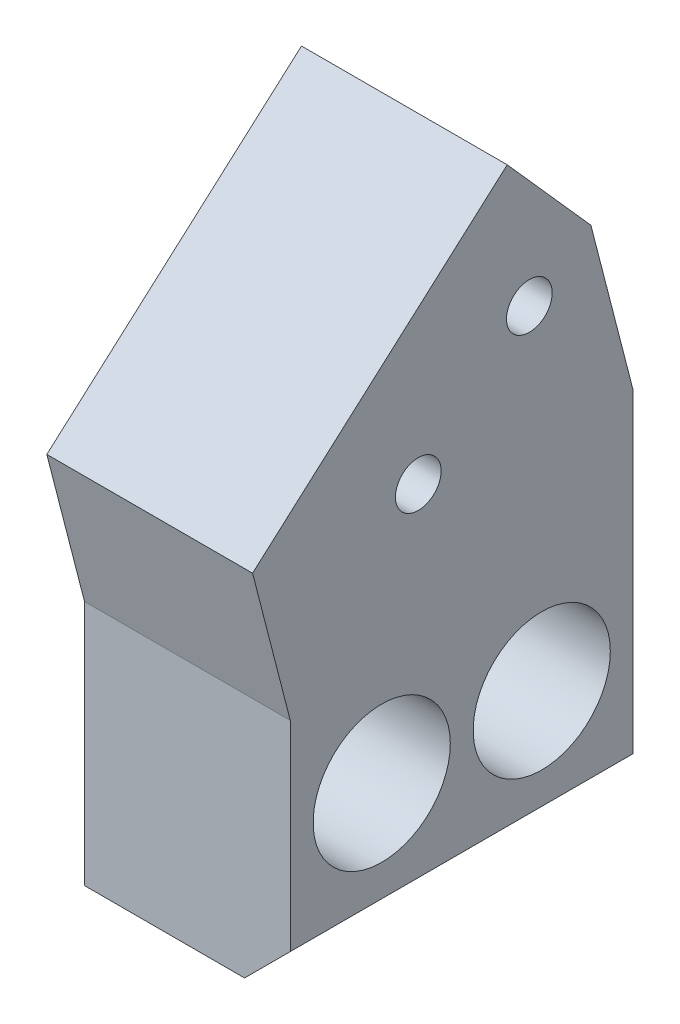
ISO-10303-21;
HEADER;
FILE_DESCRIPTION(('STEP AP214'),'2;1');
FILE_NAME('part.step','',(''),(''),'','','');
FILE_SCHEMA(('AUTOMOTIVE_DESIGN { 1 0 10303 214 1 1 1 1 }'));
ENDSEC;
DATA;
#1=APPLICATION_CONTEXT('core data for automotive mechanical design processes');
#2=APPLICATION_PROTOCOL_DEFINITION('international standard','automotive_design',2000,#1);
#3=PRODUCT_CONTEXT('',#1,'mechanical');
#4=PRODUCT('Part','Part','',(#3));
#5=PRODUCT_RELATED_PRODUCT_CATEGORY('part','',(#4));
#6=PRODUCT_DEFINITION_FORMATION('','',#4);
#7=PRODUCT_DEFINITION_CONTEXT('part definition',#1,'design');
#8=PRODUCT_DEFINITION('design','',#6,#7);
#9=PRODUCT_DEFINITION_SHAPE('','',#8);
#10=(LENGTH_UNIT() NAMED_UNIT(*) SI_UNIT(.MILLI.,.METRE.));
#11=(NAMED_UNIT(*) PLANE_ANGLE_UNIT() SI_UNIT($,.RADIAN.));
#12=(NAMED_UNIT(*) SI_UNIT($,.STERADIAN.) SOLID_ANGLE_UNIT());
#13=UNCERTAINTY_MEASURE_WITH_UNIT(LENGTH_MEASURE(1.E-05),#10,'distance_accuracy_value','');
#14=(GEOMETRIC_REPRESENTATION_CONTEXT(3) GLOBAL_UNCERTAINTY_ASSIGNED_CONTEXT((#13)) GLOBAL_UNIT_ASSIGNED_CONTEXT((#10,
#11,#12)) REPRESENTATION_CONTEXT('',''));
#15=CARTESIAN_POINT('',(0.,0.,0.));
#16=DIRECTION('',(0.,0.,1.));
#17=DIRECTION('',(1.,0.,0.));
#18=AXIS2_PLACEMENT_3D('',#15,#16,#17);
#19=CARTESIAN_POINT('',(0.,6.38000184775112,3.49999999999998));
#20=DIRECTION('',(1.,0.,0.));
#21=DIRECTION('',(0.,0.,-1.));
#22=AXIS2_PLACEMENT_3D('',#19,#20,#21);
#23=CYLINDRICAL_SURFACE('',#22,1.4110167171284);
#24=CARTESIAN_POINT('',(0.,6.38000184775112,3.49999999999998));
#25=DIRECTION('',(1.,0.,0.));
#26=DIRECTION('',(0.,0.,-1.));
#27=AXIS2_PLACEMENT_3D('',#24,#25,#26);
#28=CIRCLE('',#27,1.4110167171284);
#29=CARTESIAN_POINT('',(0.,6.38000184775112,2.08898328287158));
#30=VERTEX_POINT('',#29);
#31=EDGE_CURVE('E117',#30,#30,#28,.T.);
#32=ORIENTED_EDGE('',*,*,#31,.F.);
#33=EDGE_LOOP('',(#32));
#34=FACE_BOUND('',#33,.T.);
#35=CARTESIAN_POINT('',(4.,6.38000184775112,3.49999999999998));
#36=DIRECTION('',(1.,0.,0.));
#37=DIRECTION('',(0.,0.,-1.));
#38=AXIS2_PLACEMENT_3D('',#35,#36,#37);
#39=CIRCLE('',#38,1.4110167171284);
#40=CARTESIAN_POINT('',(4.,6.38000184775112,2.08898328287158));
#41=VERTEX_POINT('',#40);
#42=EDGE_CURVE('E46',#41,#41,#39,.F.);
#43=ORIENTED_EDGE('',*,*,#42,.F.);
#44=EDGE_LOOP('',(#43));
#45=FACE_BOUND('',#44,.T.);
#46=ADVANCED_FACE('F41',(#34,#45),#23,.F.);
#47=CARTESIAN_POINT('',(0.,6.38000180263647,-3.50000002822895));
#48=DIRECTION('',(1.,0.,0.));
#49=DIRECTION('',(0.,0.,-1.));
#50=AXIS2_PLACEMENT_3D('',#47,#48,#49);
#51=CYLINDRICAL_SURFACE('',#50,1.41101671712844);
#52=CARTESIAN_POINT('',(0.,6.38000180263647,-3.50000002822895));
#53=DIRECTION('',(1.,0.,0.));
#54=DIRECTION('',(0.,0.,-1.));
#55=AXIS2_PLACEMENT_3D('',#52,#53,#54);
#56=CIRCLE('',#55,1.41101671712844);
#57=CARTESIAN_POINT('',(0.,6.38000180263647,-4.91101674535739));
#58=VERTEX_POINT('',#57);
#59=EDGE_CURVE('E165',#58,#58,#56,.T.);
#60=ORIENTED_EDGE('',*,*,#59,.F.);
#61=EDGE_LOOP('',(#60));
#62=FACE_BOUND('',#61,.T.);
#63=CARTESIAN_POINT('',(4.,6.38000180263647,-3.50000002822895));
#64=DIRECTION('',(1.,0.,0.));
#65=DIRECTION('',(0.,0.,-1.));
#66=AXIS2_PLACEMENT_3D('',#63,#64,#65);
#67=CIRCLE('',#66,1.41101671712844);
#68=CARTESIAN_POINT('',(4.,6.38000180263647,-4.91101674535739));
#69=VERTEX_POINT('',#68);
#70=EDGE_CURVE('E166',#69,#69,#67,.F.);
#71=ORIENTED_EDGE('',*,*,#70,.F.);
#72=EDGE_LOOP('',(#71));
#73=FACE_BOUND('',#72,.T.);
#74=ADVANCED_FACE('F254',(#62,#73),#51,.F.);
#75=CARTESIAN_POINT('',(9.,0.,0.));
#76=DIRECTION('',(-1.,0.,0.));
#77=DIRECTION('',(0.,0.,1.));
#78=AXIS2_PLACEMENT_3D('',#75,#76,#77);
#79=PLANE('',#78);
#80=CARTESIAN_POINT('',(9.,6.38000180263647,-3.50000002822895));
#81=DIRECTION('',(1.,0.,0.));
#82=DIRECTION('',(0.,0.,-1.));
#83=AXIS2_PLACEMENT_3D('',#80,#81,#82);
#84=CIRCLE('',#83,3.);
#85=CARTESIAN_POINT('',(9.,6.38000180263647,-6.50000002822895));
#86=VERTEX_POINT('',#85);
#87=EDGE_CURVE('E173',#86,#86,#84,.T.);
#88=ORIENTED_EDGE('',*,*,#87,.F.);
#89=EDGE_LOOP('',(#88));
#90=FACE_BOUND('',#89,.T.);
#91=CARTESIAN_POINT('',(9.,6.38000184775112,3.49999999999998));
#92=DIRECTION('',(1.,0.,0.));
#93=DIRECTION('',(0.,0.,-1.));
#94=AXIS2_PLACEMENT_3D('',#91,#92,#93);
#95=CIRCLE('',#94,3.);
#96=CARTESIAN_POINT('',(9.,6.38000184775112,0.499999999999976));
#97=VERTEX_POINT('',#96);
#98=EDGE_CURVE('E178',#97,#97,#95,.T.);
#99=ORIENTED_EDGE('',*,*,#98,.F.);
#100=EDGE_LOOP('',(#99));
#101=FACE_BOUND('',#100,.T.);
#102=DIRECTION('',(0.,0.968365769479698,0.249535040625543));
#103=VECTOR('',#102,1.);
#104=CARTESIAN_POINT('',(9.,15.76,-7.5));
#105=LINE('',#104,#103);
#106=CARTESIAN_POINT('',(9.,15.76,-7.5));
#107=VERTEX_POINT('',#106);
#108=CARTESIAN_POINT('',(9.,22.9454674644234,-5.64840014779561));
#109=VERTEX_POINT('',#108);
#110=EDGE_CURVE('E210',#107,#109,#105,.T.);
#111=ORIENTED_EDGE('',*,*,#110,.T.);
#112=DIRECTION('',(0.,-0.747468419387555,-0.66429734458168));
#113=VECTOR('',#112,1.);
#114=CARTESIAN_POINT('',(9.,27.0613080113577,-1.99053063099333));
#115=LINE('',#114,#113);
#116=CARTESIAN_POINT('',(9.,27.0613080113577,-1.99053063099333));
#117=VERTEX_POINT('',#116);
#118=EDGE_CURVE('E112',#117,#109,#115,.T.);
#119=ORIENTED_EDGE('',*,*,#118,.F.);
#120=DIRECTION('',(0.,-0.66429734458168,0.747468419387554));
#121=VECTOR('',#120,1.);
#122=CARTESIAN_POINT('',(9.,17.1608977362608,9.14942661853484));
#123=LINE('',#122,#121);
#124=CARTESIAN_POINT('',(9.,17.1608977362608,9.14942661853484));
#125=VERTEX_POINT('',#124);
#126=EDGE_CURVE('E145',#117,#125,#123,.T.);
#127=ORIENTED_EDGE('',*,*,#126,.T.);
#128=DIRECTION('',(0.,-0.968365769479698,-0.249535040625543));
#129=VECTOR('',#128,1.);
#130=CARTESIAN_POINT('',(9.,10.76,7.5));
#131=LINE('',#130,#129);
#132=CARTESIAN_POINT('',(9.,10.76,7.5));
#133=VERTEX_POINT('',#132);
#134=EDGE_CURVE('E136',#125,#133,#131,.T.);
#135=ORIENTED_EDGE('',*,*,#134,.T.);
#136=DIRECTION('',(0.,-1.,0.));
#137=VECTOR('',#136,1.);
#138=CARTESIAN_POINT('',(9.,0.,7.5));
#139=LINE('',#138,#137);
#140=CARTESIAN_POINT('',(9.,1.99999999999999,7.5));
#141=VERTEX_POINT('',#140);
#142=EDGE_CURVE('E206',#133,#141,#139,.T.);
#143=ORIENTED_EDGE('',*,*,#142,.T.);
#144=DIRECTION('',(0.,0.,-1.));
#145=VECTOR('',#144,1.);
#146=CARTESIAN_POINT('',(9.,1.99999999999999,0.));
#147=LINE('',#146,#145);
#148=CARTESIAN_POINT('',(9.,1.99999999999999,-7.5));
#149=VERTEX_POINT('',#148);
#150=EDGE_CURVE('E51',#141,#149,#147,.T.);
#151=ORIENTED_EDGE('',*,*,#150,.T.);
#152=DIRECTION('',(0.,1.,0.));
#153=VECTOR('',#152,1.);
#154=CARTESIAN_POINT('',(9.,0.,-7.5));
#155=LINE('',#154,#153);
#156=EDGE_CURVE('E208',#149,#107,#155,.T.);
#157=ORIENTED_EDGE('',*,*,#156,.T.);
#158=EDGE_LOOP('',(#111,#119,#127,#135,#143,#151,#157));
#159=FACE_BOUND('',#158,.T.);
#160=CARTESIAN_POINT('',(9.,21.2314292789877,-2.95749183283099));
#161=DIRECTION('',(1.,0.,0.));
#162=DIRECTION('',(0.,0.,-1.));
#163=AXIS2_PLACEMENT_3D('',#160,#161,#162);
#164=CIRCLE('',#163,0.999999999999999);
#165=CARTESIAN_POINT('',(9.,21.2314292789877,-3.95749183283099));
#166=VERTEX_POINT('',#165);
#167=EDGE_CURVE('E198',#166,#166,#164,.T.);
#168=ORIENTED_EDGE('',*,*,#167,.F.);
#169=EDGE_LOOP('',(#168));
#170=FACE_BOUND('',#169,.T.);
#171=CARTESIAN_POINT('',(9.,16.9134965392068,1.90105289318811));
#172=DIRECTION('',(1.,0.,0.));
#173=DIRECTION('',(0.,0.,-1.));
#174=AXIS2_PLACEMENT_3D('',#171,#172,#173);
#175=CIRCLE('',#174,1.);
#176=CARTESIAN_POINT('',(9.,16.9134965392068,0.901052893188108));
#177=VERTEX_POINT('',#176);
#178=EDGE_CURVE('E192',#177,#177,#175,.T.);
#179=ORIENTED_EDGE('',*,*,#178,.F.);
#180=EDGE_LOOP('',(#179));
#181=FACE_BOUND('',#180,.T.);
#182=ADVANCED_FACE('F239',(#90,#101,#159,#170,#181),#79,.F.);
#183=CARTESIAN_POINT('',(0.,0.,0.));
#184=DIRECTION('',(-1.,0.,0.));
#185=DIRECTION('',(0.,0.,1.));
#186=AXIS2_PLACEMENT_3D('',#183,#184,#185);
#187=PLANE('',#186);
#188=DIRECTION('',(0.,-0.747468419387555,-0.66429734458168));
#189=VECTOR('',#188,1.);
#190=CARTESIAN_POINT('',(0.,27.0613080113577,-1.99053063099333));
#191=LINE('',#190,#189);
#192=CARTESIAN_POINT('',(0.,27.0613080113577,-1.99053063099333));
#193=VERTEX_POINT('',#192);
#194=CARTESIAN_POINT('',(0.,22.9454674644234,-5.64840014779561));
#195=VERTEX_POINT('',#194);
#196=EDGE_CURVE('E59',#193,#195,#191,.T.);
#197=ORIENTED_EDGE('',*,*,#196,.T.);
#198=DIRECTION('',(0.,0.968365769479698,0.249535040625543));
#199=VECTOR('',#198,1.);
#200=CARTESIAN_POINT('',(0.,15.76,-7.5));
#201=LINE('',#200,#199);
#202=CARTESIAN_POINT('',(0.,15.76,-7.5));
#203=VERTEX_POINT('',#202);
#204=EDGE_CURVE('E126',#203,#195,#201,.T.);
#205=ORIENTED_EDGE('',*,*,#204,.F.);
#206=DIRECTION('',(0.,1.,0.));
#207=VECTOR('',#206,1.);
#208=CARTESIAN_POINT('',(0.,0.,-7.5));
#209=LINE('',#208,#207);
#210=CARTESIAN_POINT('',(0.,1.99999999999999,-7.5));
#211=VERTEX_POINT('',#210);
#212=EDGE_CURVE('E134',#211,#203,#209,.T.);
#213=ORIENTED_EDGE('',*,*,#212,.F.);
#214=DIRECTION('',(0.,0.707106781186547,-0.707106781186548));
#215=VECTOR('',#214,1.);
#216=CARTESIAN_POINT('',(0.,-2.75,-2.75));
#217=LINE('',#216,#215);
#218=CARTESIAN_POINT('',(0.,0.,-5.5));
#219=VERTEX_POINT('',#218);
#220=EDGE_CURVE('E155',#211,#219,#217,.F.);
#221=ORIENTED_EDGE('',*,*,#220,.T.);
#222=DIRECTION('',(0.,0.,-1.));
#223=VECTOR('',#222,1.);
#224=CARTESIAN_POINT('',(0.,0.,7.5));
#225=LINE('',#224,#223);
#226=CARTESIAN_POINT('',(0.,0.,7.5));
#227=VERTEX_POINT('',#226);
#228=EDGE_CURVE('E138',#227,#219,#225,.T.);
#229=ORIENTED_EDGE('',*,*,#228,.F.);
#230=DIRECTION('',(0.,-1.,0.));
#231=VECTOR('',#230,1.);
#232=CARTESIAN_POINT('',(0.,0.,7.5));
#233=LINE('',#232,#231);
#234=CARTESIAN_POINT('',(0.,10.76,7.5));
#235=VERTEX_POINT('',#234);
#236=EDGE_CURVE('E215',#235,#227,#233,.T.);
#237=ORIENTED_EDGE('',*,*,#236,.F.);
#238=DIRECTION('',(0.,-0.968365769479698,-0.249535040625543));
#239=VECTOR('',#238,1.);
#240=CARTESIAN_POINT('',(0.,10.76,7.5));
#241=LINE('',#240,#239);
#242=CARTESIAN_POINT('',(0.,17.1608977362608,9.14942661853484));
#243=VERTEX_POINT('',#242);
#244=EDGE_CURVE('E201',#243,#235,#241,.T.);
#245=ORIENTED_EDGE('',*,*,#244,.F.);
#246=DIRECTION('',(0.,-0.66429734458168,0.747468419387554));
#247=VECTOR('',#246,1.);
#248=CARTESIAN_POINT('',(0.,17.1608977362608,9.14942661853484));
#249=LINE('',#248,#247);
#250=EDGE_CURVE('E128',#193,#243,#249,.T.);
#251=ORIENTED_EDGE('',*,*,#250,.F.);
#252=EDGE_LOOP('',(#197,#205,#213,#221,#229,#237,#245,#251));
#253=FACE_BOUND('',#252,.T.);
#254=ORIENTED_EDGE('',*,*,#59,.T.);
#255=EDGE_LOOP('',(#254));
#256=FACE_BOUND('',#255,.T.);
#257=ORIENTED_EDGE('',*,*,#31,.T.);
#258=EDGE_LOOP('',(#257));
#259=FACE_BOUND('',#258,.T.);
#260=CARTESIAN_POINT('',(0.,21.2314292789877,-2.95749183283099));
#261=DIRECTION('',(1.,0.,0.));
#262=DIRECTION('',(0.,0.,-1.));
#263=AXIS2_PLACEMENT_3D('',#260,#261,#262);
#264=CIRCLE('',#263,0.999999999999999);
#265=CARTESIAN_POINT('',(0.,21.2314292789877,-3.95749183283099));
#266=VERTEX_POINT('',#265);
#267=EDGE_CURVE('E195',#266,#266,#264,.T.);
#268=ORIENTED_EDGE('',*,*,#267,.T.);
#269=EDGE_LOOP('',(#268));
#270=FACE_BOUND('',#269,.T.);
#271=CARTESIAN_POINT('',(0.,16.9134965392068,1.90105289318811));
#272=DIRECTION('',(1.,0.,0.));
#273=DIRECTION('',(0.,0.,-1.));
#274=AXIS2_PLACEMENT_3D('',#271,#272,#273);
#275=CIRCLE('',#274,1.);
#276=CARTESIAN_POINT('',(0.,16.9134965392068,0.901052893188108));
#277=VERTEX_POINT('',#276);
#278=EDGE_CURVE('E164',#277,#277,#275,.T.);
#279=ORIENTED_EDGE('',*,*,#278,.T.);
#280=EDGE_LOOP('',(#279));
#281=FACE_BOUND('',#280,.T.);
#282=ADVANCED_FACE('F123',(#253,#256,#259,#270,#281),#187,.T.);
#283=CARTESIAN_POINT('',(9.,10.76,7.5));
#284=DIRECTION('',(0.,0.249535040625543,-0.968365769479699));
#285=DIRECTION('',(0.,0.968365769479699,0.249535040625543));
#286=AXIS2_PLACEMENT_3D('',#283,#284,#285);
#287=PLANE('',#286);
#288=ORIENTED_EDGE('',*,*,#244,.T.);
#289=DIRECTION('',(-1.,0.,0.));
#290=VECTOR('',#289,1.);
#291=CARTESIAN_POINT('',(9.,10.76,7.5));
#292=LINE('',#291,#290);
#293=EDGE_CURVE('E149',#133,#235,#292,.T.);
#294=ORIENTED_EDGE('',*,*,#293,.F.);
#295=ORIENTED_EDGE('',*,*,#134,.F.);
#296=DIRECTION('',(-1.,0.,0.));
#297=VECTOR('',#296,1.);
#298=CARTESIAN_POINT('',(9.,17.1608977362608,9.14942661853484));
#299=LINE('',#298,#297);
#300=EDGE_CURVE('E142',#125,#243,#299,.T.);
#301=ORIENTED_EDGE('',*,*,#300,.T.);
#302=EDGE_LOOP('',(#288,#294,#295,#301));
#303=FACE_BOUND('',#302,.T.);
#304=ADVANCED_FACE('F232',(#303),#287,.F.);
#305=CARTESIAN_POINT('',(9.,0.,7.5));
#306=DIRECTION('',(0.,0.,-1.));
#307=DIRECTION('',(-1.,0.,0.));
#308=AXIS2_PLACEMENT_3D('',#305,#306,#307);
#309=PLANE('',#308);
#310=DIRECTION('',(-1.,0.,0.));
#311=VECTOR('',#310,1.);
#312=CARTESIAN_POINT('',(9.,0.,7.5));
#313=LINE('',#312,#311);
#314=CARTESIAN_POINT('',(7.,0.,7.5));
#315=VERTEX_POINT('',#314);
#316=EDGE_CURVE('E147',#315,#227,#313,.T.);
#317=ORIENTED_EDGE('',*,*,#316,.F.);
#318=DIRECTION('',(-0.707106781186548,-0.707106781186547,0.));
#319=VECTOR('',#318,1.);
#320=CARTESIAN_POINT('',(9.,1.99999999999999,7.5));
#321=LINE('',#320,#319);
#322=EDGE_CURVE('E11',#315,#141,#321,.F.);
#323=ORIENTED_EDGE('',*,*,#322,.T.);
#324=ORIENTED_EDGE('',*,*,#142,.F.);
#325=ORIENTED_EDGE('',*,*,#293,.T.);
#326=ORIENTED_EDGE('',*,*,#236,.T.);
#327=EDGE_LOOP('',(#317,#323,#324,#325,#326));
#328=FACE_BOUND('',#327,.T.);
#329=ADVANCED_FACE('F229',(#328),#309,.F.);
#330=CARTESIAN_POINT('',(9.,0.,7.5));
#331=DIRECTION('',(0.,1.,0.));
#332=DIRECTION('',(0.,0.,1.));
#333=AXIS2_PLACEMENT_3D('',#330,#331,#332);
#334=PLANE('',#333);
#335=ORIENTED_EDGE('',*,*,#228,.T.);
#336=DIRECTION('',(1.,0.,0.));
#337=VECTOR('',#336,1.);
#338=CARTESIAN_POINT('',(9.,0.,-5.5));
#339=LINE('',#338,#337);
#340=CARTESIAN_POINT('',(7.,0.,-5.5));
#341=VERTEX_POINT('',#340);
#342=EDGE_CURVE('E159',#219,#341,#339,.T.);
#343=ORIENTED_EDGE('',*,*,#342,.T.);
#344=DIRECTION('',(0.,0.,1.));
#345=VECTOR('',#344,1.);
#346=CARTESIAN_POINT('',(7.,0.,7.5));
#347=LINE('',#346,#345);
#348=EDGE_CURVE('E157',#341,#315,#347,.T.);
#349=ORIENTED_EDGE('',*,*,#348,.T.);
#350=ORIENTED_EDGE('',*,*,#316,.T.);
#351=EDGE_LOOP('',(#335,#343,#349,#350));
#352=FACE_BOUND('',#351,.T.);
#353=ADVANCED_FACE('F221',(#352),#334,.F.);
#354=CARTESIAN_POINT('',(9.,0.,-7.5));
#355=DIRECTION('',(0.,0.,1.));
#356=DIRECTION('',(1.,0.,0.));
#357=AXIS2_PLACEMENT_3D('',#354,#355,#356);
#358=PLANE('',#357);
#359=ORIENTED_EDGE('',*,*,#156,.F.);
#360=DIRECTION('',(-1.,0.,0.));
#361=VECTOR('',#360,1.);
#362=CARTESIAN_POINT('',(9.,1.99999999999999,-7.5));
#363=LINE('',#362,#361);
#364=EDGE_CURVE('E152',#149,#211,#363,.T.);
#365=ORIENTED_EDGE('',*,*,#364,.T.);
#366=ORIENTED_EDGE('',*,*,#212,.T.);
#367=DIRECTION('',(-1.,0.,0.));
#368=VECTOR('',#367,1.);
#369=CARTESIAN_POINT('',(9.,15.76,-7.5));
#370=LINE('',#369,#368);
#371=EDGE_CURVE('E133',#107,#203,#370,.T.);
#372=ORIENTED_EDGE('',*,*,#371,.F.);
#373=EDGE_LOOP('',(#359,#365,#366,#372));
#374=FACE_BOUND('',#373,.T.);
#375=ADVANCED_FACE('F243',(#374),#358,.F.);
#376=CARTESIAN_POINT('',(9.,15.76,-7.5));
#377=DIRECTION('',(0.,-0.249535040625543,0.968365769479699));
#378=DIRECTION('',(0.,-0.968365769479699,-0.249535040625543));
#379=AXIS2_PLACEMENT_3D('',#376,#377,#378);
#380=PLANE('',#379);
#381=ORIENTED_EDGE('',*,*,#204,.T.);
#382=DIRECTION('',(1.,0.,0.));
#383=VECTOR('',#382,1.);
#384=CARTESIAN_POINT('',(0.,22.9454674644234,-5.64840014779561));
#385=LINE('',#384,#383);
#386=EDGE_CURVE('E109',#195,#109,#385,.T.);
#387=ORIENTED_EDGE('',*,*,#386,.T.);
#388=ORIENTED_EDGE('',*,*,#110,.F.);
#389=ORIENTED_EDGE('',*,*,#371,.T.);
#390=EDGE_LOOP('',(#381,#387,#388,#389));
#391=FACE_BOUND('',#390,.T.);
#392=ADVANCED_FACE('F131',(#391),#380,.F.);
#393=CARTESIAN_POINT('',(9.,17.1608977362608,9.14942661853484));
#394=DIRECTION('',(0.,-0.747468419387554,-0.66429734458168));
#395=DIRECTION('',(0.,0.66429734458168,-0.747468419387554));
#396=AXIS2_PLACEMENT_3D('',#393,#394,#395);
#397=PLANE('',#396);
#398=ORIENTED_EDGE('',*,*,#126,.F.);
#399=DIRECTION('',(1.,0.,0.));
#400=VECTOR('',#399,1.);
#401=CARTESIAN_POINT('',(0.,27.0613080113577,-1.99053063099333));
#402=LINE('',#401,#400);
#403=EDGE_CURVE('E118',#193,#117,#402,.T.);
#404=ORIENTED_EDGE('',*,*,#403,.F.);
#405=ORIENTED_EDGE('',*,*,#250,.T.);
#406=ORIENTED_EDGE('',*,*,#300,.F.);
#407=EDGE_LOOP('',(#398,#404,#405,#406));
#408=FACE_BOUND('',#407,.T.);
#409=ADVANCED_FACE('F237',(#408),#397,.F.);
#410=CARTESIAN_POINT('',(9.,21.2314292789877,-2.95749183283099));
#411=DIRECTION('',(-1.,0.,0.));
#412=DIRECTION('',(0.,0.,1.));
#413=AXIS2_PLACEMENT_3D('',#410,#411,#412);
#414=CYLINDRICAL_SURFACE('',#413,0.999999999999999);
#415=ORIENTED_EDGE('',*,*,#167,.T.);
#416=EDGE_LOOP('',(#415));
#417=FACE_BOUND('',#416,.T.);
#418=ORIENTED_EDGE('',*,*,#267,.F.);
#419=EDGE_LOOP('',(#418));
#420=FACE_BOUND('',#419,.T.);
#421=ADVANCED_FACE('F270',(#417,#420),#414,.F.);
#422=CARTESIAN_POINT('',(9.,16.9134965392068,1.90105289318811));
#423=DIRECTION('',(-1.,0.,0.));
#424=DIRECTION('',(0.,0.,1.));
#425=AXIS2_PLACEMENT_3D('',#422,#423,#424);
#426=CYLINDRICAL_SURFACE('',#425,1.);
#427=ORIENTED_EDGE('',*,*,#178,.T.);
#428=EDGE_LOOP('',(#427));
#429=FACE_BOUND('',#428,.T.);
#430=ORIENTED_EDGE('',*,*,#278,.F.);
#431=EDGE_LOOP('',(#430));
#432=FACE_BOUND('',#431,.T.);
#433=ADVANCED_FACE('F267',(#429,#432),#426,.F.);
#434=CARTESIAN_POINT('',(9.,1.99999999999999,0.));
#435=DIRECTION('',(-0.707106781186547,0.707106781186548,0.));
#436=DIRECTION('',(0.,0.,-1.));
#437=AXIS2_PLACEMENT_3D('',#434,#435,#436);
#438=PLANE('',#437);
#439=ORIENTED_EDGE('',*,*,#322,.F.);
#440=ORIENTED_EDGE('',*,*,#348,.F.);
#441=DIRECTION('',(0.577350269189626,0.577350269189625,-0.577350269189626));
#442=VECTOR('',#441,1.);
#443=CARTESIAN_POINT('',(6.5,-0.500000000000003,-5.));
#444=LINE('',#443,#442);
#445=EDGE_CURVE('E162',#149,#341,#444,.F.);
#446=ORIENTED_EDGE('',*,*,#445,.F.);
#447=ORIENTED_EDGE('',*,*,#150,.F.);
#448=EDGE_LOOP('',(#439,#440,#446,#447));
#449=FACE_BOUND('',#448,.T.);
#450=ADVANCED_FACE('F44',(#449),#438,.F.);
#451=CARTESIAN_POINT('',(9.,1.99999999999999,-7.5));
#452=DIRECTION('',(0.,0.707106781186548,0.707106781186547));
#453=DIRECTION('',(-1.,0.,0.));
#454=AXIS2_PLACEMENT_3D('',#451,#452,#453);
#455=PLANE('',#454);
#456=ORIENTED_EDGE('',*,*,#445,.T.);
#457=ORIENTED_EDGE('',*,*,#342,.F.);
#458=ORIENTED_EDGE('',*,*,#220,.F.);
#459=ORIENTED_EDGE('',*,*,#364,.F.);
#460=EDGE_LOOP('',(#456,#457,#458,#459));
#461=FACE_BOUND('',#460,.T.);
#462=ADVANCED_FACE('F224',(#461),#455,.F.);
#463=CARTESIAN_POINT('',(0.,27.0613080113577,-1.99053063099333));
#464=DIRECTION('',(0.,-0.66429734458168,0.747468419387555));
#465=DIRECTION('',(0.,-0.747468419387555,-0.66429734458168));
#466=AXIS2_PLACEMENT_3D('',#463,#464,#465);
#467=PLANE('',#466);
#468=ORIENTED_EDGE('',*,*,#118,.T.);
#469=ORIENTED_EDGE('',*,*,#386,.F.);
#470=ORIENTED_EDGE('',*,*,#196,.F.);
#471=ORIENTED_EDGE('',*,*,#403,.T.);
#472=EDGE_LOOP('',(#468,#469,#470,#471));
#473=FACE_BOUND('',#472,.T.);
#474=ADVANCED_FACE('F110',(#473),#467,.F.);
#475=CARTESIAN_POINT('',(4.,6.38000180263647,-3.50000002822895));
#476=DIRECTION('',(1.,0.,0.));
#477=DIRECTION('',(0.,0.,-1.));
#478=AXIS2_PLACEMENT_3D('',#475,#476,#477);
#479=PLANE('',#478);
#480=CARTESIAN_POINT('',(4.,6.38000180263647,-3.50000002822895));
#481=DIRECTION('',(1.,0.,0.));
#482=DIRECTION('',(0.,0.,-1.));
#483=AXIS2_PLACEMENT_3D('',#480,#481,#482);
#484=CIRCLE('',#483,3.);
#485=CARTESIAN_POINT('',(4.,6.38000180263647,-6.50000002822895));
#486=VERTEX_POINT('',#485);
#487=EDGE_CURVE('E168',#486,#486,#484,.T.);
#488=ORIENTED_EDGE('',*,*,#487,.T.);
#489=EDGE_LOOP('',(#488));
#490=FACE_BOUND('',#489,.T.);
#491=ORIENTED_EDGE('',*,*,#70,.T.);
#492=EDGE_LOOP('',(#491));
#493=FACE_BOUND('',#492,.T.);
#494=ADVANCED_FACE('F291',(#490,#493),#479,.T.);
#495=CARTESIAN_POINT('',(4.,6.38000180263647,-3.50000002822895));
#496=DIRECTION('',(1.,0.,0.));
#497=DIRECTION('',(0.,0.,-1.));
#498=AXIS2_PLACEMENT_3D('',#495,#496,#497);
#499=CYLINDRICAL_SURFACE('',#498,3.);
#500=ORIENTED_EDGE('',*,*,#487,.F.);
#501=EDGE_LOOP('',(#500));
#502=FACE_BOUND('',#501,.T.);
#503=ORIENTED_EDGE('',*,*,#87,.T.);
#504=EDGE_LOOP('',(#503));
#505=FACE_BOUND('',#504,.T.);
#506=ADVANCED_FACE('F317',(#502,#505),#499,.F.);
#507=CARTESIAN_POINT('',(4.,6.38000184775112,3.49999999999998));
#508=DIRECTION('',(1.,0.,0.));
#509=DIRECTION('',(0.,0.,-1.));
#510=AXIS2_PLACEMENT_3D('',#507,#508,#509);
#511=PLANE('',#510);
#512=CARTESIAN_POINT('',(4.,6.38000184775112,3.49999999999998));
#513=DIRECTION('',(1.,0.,0.));
#514=DIRECTION('',(0.,0.,-1.));
#515=AXIS2_PLACEMENT_3D('',#512,#513,#514);
#516=CIRCLE('',#515,3.);
#517=CARTESIAN_POINT('',(4.,6.38000184775112,0.499999999999976));
#518=VERTEX_POINT('',#517);
#519=EDGE_CURVE('E183',#518,#518,#516,.T.);
#520=ORIENTED_EDGE('',*,*,#519,.T.);
#521=EDGE_LOOP('',(#520));
#522=FACE_BOUND('',#521,.T.);
#523=ORIENTED_EDGE('',*,*,#42,.T.);
#524=EDGE_LOOP('',(#523));
#525=FACE_BOUND('',#524,.T.);
#526=ADVANCED_FACE('F326',(#522,#525),#511,.T.);
#527=CARTESIAN_POINT('',(4.,6.38000184775112,3.49999999999998));
#528=DIRECTION('',(1.,0.,0.));
#529=DIRECTION('',(0.,0.,-1.));
#530=AXIS2_PLACEMENT_3D('',#527,#528,#529);
#531=CYLINDRICAL_SURFACE('',#530,3.);
#532=ORIENTED_EDGE('',*,*,#519,.F.);
#533=EDGE_LOOP('',(#532));
#534=FACE_BOUND('',#533,.T.);
#535=ORIENTED_EDGE('',*,*,#98,.T.);
#536=EDGE_LOOP('',(#535));
#537=FACE_BOUND('',#536,.T.);
#538=ADVANCED_FACE('F336',(#534,#537),#531,.F.);
#539=CLOSED_SHELL('',(#46,#74,#182,#282,#304,#329,#353,#375,#392,#409,#421,#433,#450,#462,#474,
#494,#506,#526,#538));
#540=MANIFOLD_SOLID_BREP('B2',#539);
#541=ADVANCED_BREP_SHAPE_REPRESENTATION('',(#18,#540),#14);
#542=SHAPE_DEFINITION_REPRESENTATION(#9,#541);
ENDSEC;
END-ISO-10303-21;
